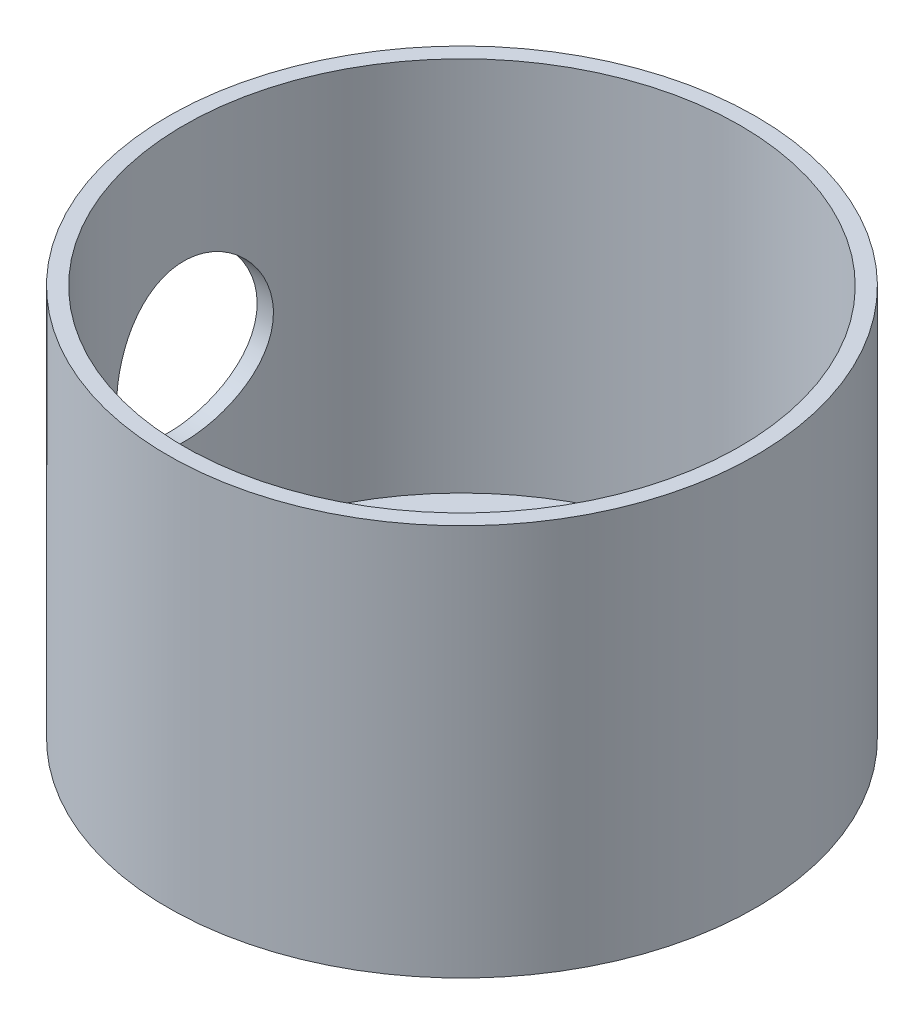
ISO-10303-21;
HEADER;
FILE_DESCRIPTION(('STEP AP214'),'2;1');
FILE_NAME('part.step','',(''),(''),'','','');
FILE_SCHEMA(('AUTOMOTIVE_DESIGN { 1 0 10303 214 1 1 1 1 }'));
ENDSEC;
DATA;
#1=APPLICATION_CONTEXT('core data for automotive mechanical design processes');
#2=APPLICATION_PROTOCOL_DEFINITION('international standard','automotive_design',2000,#1);
#3=PRODUCT_CONTEXT('',#1,'mechanical');
#4=PRODUCT('Part','Part','',(#3));
#5=PRODUCT_RELATED_PRODUCT_CATEGORY('part','',(#4));
#6=PRODUCT_DEFINITION_FORMATION('','',#4);
#7=PRODUCT_DEFINITION_CONTEXT('part definition',#1,'design');
#8=PRODUCT_DEFINITION('design','',#6,#7);
#9=PRODUCT_DEFINITION_SHAPE('','',#8);
#10=(LENGTH_UNIT() NAMED_UNIT(*) SI_UNIT(.MILLI.,.METRE.));
#11=(NAMED_UNIT(*) PLANE_ANGLE_UNIT() SI_UNIT($,.RADIAN.));
#12=(NAMED_UNIT(*) SI_UNIT($,.STERADIAN.) SOLID_ANGLE_UNIT());
#13=UNCERTAINTY_MEASURE_WITH_UNIT(LENGTH_MEASURE(1.E-05),#10,'distance_accuracy_value','');
#14=(GEOMETRIC_REPRESENTATION_CONTEXT(3) GLOBAL_UNCERTAINTY_ASSIGNED_CONTEXT((#13)) GLOBAL_UNIT_ASSIGNED_CONTEXT((#10,
#11,#12)) REPRESENTATION_CONTEXT('',''));
#15=CARTESIAN_POINT('',(0.,0.,0.));
#16=DIRECTION('',(0.,0.,1.));
#17=DIRECTION('',(1.,0.,0.));
#18=AXIS2_PLACEMENT_3D('',#15,#16,#17);
#19=CARTESIAN_POINT('',(-15.,17.7,0.));
#20=DIRECTION('',(0.,1.,0.));
#21=DIRECTION('',(0.,0.,1.));
#22=AXIS2_PLACEMENT_3D('',#19,#20,#21);
#23=PLANE('',#22);
#24=CARTESIAN_POINT('',(0.,17.7,0.));
#25=DIRECTION('',(0.,1.,0.));
#26=DIRECTION('',(0.,0.,1.));
#27=AXIS2_PLACEMENT_3D('',#24,#25,#26);
#28=CIRCLE('',#27,4.);
#29=CARTESIAN_POINT('',(0.,17.7,4.));
#30=VERTEX_POINT('',#29);
#31=EDGE_CURVE('E53',#30,#30,#28,.T.);
#32=ORIENTED_EDGE('',*,*,#31,.T.);
#33=EDGE_LOOP('',(#32));
#34=FACE_BOUND('',#33,.T.);
#35=CARTESIAN_POINT('',(0.,17.7,0.));
#36=DIRECTION('',(0.,-1.,0.));
#37=DIRECTION('',(0.,0.,-1.));
#38=AXIS2_PLACEMENT_3D('',#35,#36,#37);
#39=CIRCLE('',#38,15.);
#40=CARTESIAN_POINT('',(0.,17.7,-15.));
#41=VERTEX_POINT('',#40);
#42=EDGE_CURVE('E10',#41,#41,#39,.T.);
#43=ORIENTED_EDGE('',*,*,#42,.T.);
#44=EDGE_LOOP('',(#43));
#45=FACE_BOUND('',#44,.T.);
#46=ADVANCED_FACE('F30',(#34,#45),#23,.F.);
#47=CARTESIAN_POINT('',(0.,0.,0.));
#48=DIRECTION('',(0.,-1.,0.));
#49=DIRECTION('',(0.,0.,-1.));
#50=AXIS2_PLACEMENT_3D('',#47,#48,#49);
#51=CYLINDRICAL_SURFACE('',#50,15.);
#52=CARTESIAN_POINT('',(-14.456832294801,27.7,-4.));
#53=CARTESIAN_POINT('',(-14.456836113945,27.9203518754806,-3.99999468631742));
#54=CARTESIAN_POINT('',(-14.4619252909935,28.140760000952,-3.98172986449485));
#55=CARTESIAN_POINT('',(-14.4816712231019,28.5752108431127,-3.90929166520474));
#56=CARTESIAN_POINT('',(-14.4963327781587,28.7892503099561,-3.85510027241905));
#57=CARTESIAN_POINT('',(-14.5334475035368,29.2046161398936,-3.71271691120147));
#58=CARTESIAN_POINT('',(-14.5558897136841,29.4059599176569,-3.62457275084355));
#59=CARTESIAN_POINT('',(-14.606023098408,29.7910334801197,-3.41693569127407));
#60=CARTESIAN_POINT('',(-14.6337146806885,29.974761895014,-3.29744035682899));
#61=CARTESIAN_POINT('',(-14.6920027910693,30.3239850939754,-3.02729695749119));
#62=CARTESIAN_POINT('',(-14.7226508223289,30.4889740349289,-2.87600595008417));
#63=CARTESIAN_POINT('',(-14.7829540287301,30.7915631539024,-2.54794854568041));
#64=CARTESIAN_POINT('',(-14.8126091006688,30.9291604922836,-2.37117951069329));
#65=CARTESIAN_POINT('',(-14.8681597693684,31.1751698768059,-1.99367634174654));
#66=CARTESIAN_POINT('',(-14.8939875252459,31.2830790372657,-1.79260363975896));
#67=CARTESIAN_POINT('',(-14.9383825242367,31.4633692707345,-1.37436608945818));
#68=CARTESIAN_POINT('',(-14.9569509915253,31.5357563345631,-1.1572039617502));
#69=CARTESIAN_POINT('',(-14.9843710715292,31.6413104404715,-0.718231923620178));
#70=CARTESIAN_POINT('',(-14.9934355350053,31.6753379532518,-0.496642448401831));
#71=CARTESIAN_POINT('',(-15.001570492355,31.7059142402143,-0.0507271070171472));
#72=CARTESIAN_POINT('',(-15.0006426589323,31.7024692872603,0.173598294877067));
#73=CARTESIAN_POINT('',(-14.9890535171952,31.6588043749211,0.612628474222689));
#74=CARTESIAN_POINT('',(-14.9786382805395,31.6195140847275,0.827433201442202));
#75=CARTESIAN_POINT('',(-14.9495349718099,31.5067757244361,1.24728263114213));
#76=CARTESIAN_POINT('',(-14.9308464280136,31.4333257066278,1.45232677636124));
#77=CARTESIAN_POINT('',(-14.886931381996,31.2536403048154,1.84920789029504));
#78=CARTESIAN_POINT('',(-14.8616417575466,31.1470863857991,2.04089337265881));
#79=CARTESIAN_POINT('',(-14.8072493701969,30.9044623609813,2.4039799975293));
#80=CARTESIAN_POINT('',(-14.7781458644853,30.7683865019416,2.57537717617274));
#81=CARTESIAN_POINT('',(-14.7182254587483,30.4656462841343,2.89857073893016));
#82=CARTESIAN_POINT('',(-14.6873833872759,30.2981711099093,3.04960384035149));
#83=CARTESIAN_POINT('',(-14.6282681005693,29.9399506475144,3.32162664209938));
#84=CARTESIAN_POINT('',(-14.5999950420307,29.7492039415693,3.44261451061104));
#85=CARTESIAN_POINT('',(-14.549118045243,29.3481997963807,3.651693583714));
#86=CARTESIAN_POINT('',(-14.5265501404503,29.1378292982719,3.73957733196031));
#87=CARTESIAN_POINT('',(-14.4900865003605,28.7045470011923,3.87848003366226));
#88=CARTESIAN_POINT('',(-14.4761886145698,28.4816383271305,3.92950812921311));
#89=CARTESIAN_POINT('',(-14.459096712616,28.0367455779215,3.99193514186922));
#90=CARTESIAN_POINT('',(-14.4555952643646,27.8149329027515,4.00447265242678));
#91=CARTESIAN_POINT('',(-14.4588515677209,27.3723804543887,3.99269962245616));
#92=CARTESIAN_POINT('',(-14.4656082275034,27.1516405695216,3.96839300344559));
#93=CARTESIAN_POINT('',(-14.4883224864021,26.7218868118154,3.88462543740026));
#94=CARTESIAN_POINT('',(-14.5041007939926,26.5127291241251,3.82584895825867));
#95=CARTESIAN_POINT('',(-14.542905379049,26.1072407372805,3.67557973450926));
#96=CARTESIAN_POINT('',(-14.5659326029695,25.9109117171453,3.58408271753296));
#97=CARTESIAN_POINT('',(-14.6172714494615,25.5318900851295,3.3686581101742));
#98=CARTESIAN_POINT('',(-14.6456880974578,25.3495920482205,3.2440619047585));
#99=CARTESIAN_POINT('',(-14.7043568386728,25.0080733965937,2.96680455975028));
#100=CARTESIAN_POINT('',(-14.7346092762046,24.8488571300917,2.81413814445932));
#101=CARTESIAN_POINT('',(-14.7945992976893,24.5532950535002,2.47980756500969));
#102=CARTESIAN_POINT('',(-14.824296730477,24.4177432460428,2.2974328320177));
#103=CARTESIAN_POINT('',(-14.8789334003425,24.179178025179,1.91185687188148));
#104=CARTESIAN_POINT('',(-14.9038728906581,24.0761628798422,1.70865675403777));
#105=CARTESIAN_POINT('',(-14.9460230179852,23.906540735277,1.28862826965175));
#106=CARTESIAN_POINT('',(-14.9632911696077,23.8396619611131,1.07191570576468));
#107=CARTESIAN_POINT('',(-14.9884060757449,23.7434225438713,0.629798769462641));
#108=CARTESIAN_POINT('',(-14.9962549180996,23.7140535864506,0.404396334640487));
#109=CARTESIAN_POINT('',(-15.0015482687538,23.6941883525171,-0.0412840026923003));
#110=CARTESIAN_POINT('',(-14.9993045257616,23.7025273617377,-0.26150702305573));
#111=CARTESIAN_POINT('',(-14.9853698195772,23.7551369871504,-0.697296609261437));
#112=CARTESIAN_POINT('',(-14.9736792110957,23.7994062542341,-0.91286334962563));
#113=CARTESIAN_POINT('',(-14.9422262078185,23.9219612098372,-1.33182024692842));
#114=CARTESIAN_POINT('',(-14.9225199437846,24.0000105869449,-1.53528402370308));
#115=CARTESIAN_POINT('',(-14.8770963303299,24.1876992034925,-1.92634419694271));
#116=CARTESIAN_POINT('',(-14.8513781379851,24.2973428732256,-2.1139383633243));
#117=CARTESIAN_POINT('',(-14.7958266244824,24.548516544274,-2.47335653734734));
#118=CARTESIAN_POINT('',(-14.7659018674327,24.6908187613973,-2.64462672346662));
#119=CARTESIAN_POINT('',(-14.7056800015451,25.0018054987298,-2.96125074312266));
#120=CARTESIAN_POINT('',(-14.6753827967944,25.1704969516387,-3.10659774486097));
#121=CARTESIAN_POINT('',(-14.6170791927771,25.5339367916352,-3.37041400465123));
#122=CARTESIAN_POINT('',(-14.5891378244929,25.7291766273144,-3.48822188522467));
#123=CARTESIAN_POINT('',(-14.5396278780694,26.1374126217205,-3.68917378060109));
#124=CARTESIAN_POINT('',(-14.5180551344989,26.350397057079,-3.77234046734664));
#125=CARTESIAN_POINT('',(-14.4867200130775,26.7521626721025,-3.89076248504962));
#126=CARTESIAN_POINT('',(-14.4756028054439,26.9392025291134,-3.93163036798979));
#127=CARTESIAN_POINT('',(-14.4606577042314,27.3174811159879,-3.98624988587759));
#128=CARTESIAN_POINT('',(-14.4568289795203,27.5087193645776,-4.0000046126432));
#129=CARTESIAN_POINT('',(-14.456832294801,27.7,-4.));
#130=B_SPLINE_CURVE_WITH_KNOTS('',3,(#52,#53,#54,#55,#56,#57,#58,#59,#60,#61,#62,#63,#64,#65,
#66,#67,#68,#69,#70,#71,#72,#73,#74,#75,#76,#77,#78,#79,#80,#81,#82,#83,#84,#85,#86,#87,#88,#89,
#90,#91,#92,#93,#94,#95,#96,#97,#98,#99,#100,#101,#102,#103,#104,#105,#106,#107,#108,#109,#110,
#111,#112,#113,#114,#115,#116,#117,#118,#119,#120,#121,#122,#123,#124,#125,#126,#127,#128,#129),
.UNSPECIFIED.,.T.,.F.,(4,2,2,2,2,2,2,2,2,2,2,2,2,2,2,2,2,2,2,2,2,2,2,2,2,2,2,2,2,2,2,2,2,2,2,2,
2,2,4),(0.,0.660352256232049,1.3210358957004,1.98079262319234,2.6406006131221,3.31531832260422,
3.99010594248922,4.67570414741607,5.36118668608492,6.03096608632961,6.70063336771206,
7.35341141601607,8.00622668881391,8.6655289781114,9.32495986788982,10.0046352460066,
10.6843520527916,11.3682603019536,12.0519988484194,12.7153066848897,13.3785439269193,
14.0290370087007,14.6796150573457,15.3444926994046,16.0094954308787,16.6937181392419,
17.3779044202113,18.0568707918772,18.7356866392293,19.3936810983785,20.0516508523084,
20.7050902974225,21.3586214153685,22.0295770798807,22.7007093076701,23.3866007797608,
24.0720426420754,24.6453393534799,25.2185706858622),.UNSPECIFIED.);
#131=CARTESIAN_POINT('',(-14.456832294801,27.7,-4.));
#132=VERTEX_POINT('',#131);
#133=EDGE_CURVE('E59',#132,#132,#130,.T.);
#134=ORIENTED_EDGE('',*,*,#133,.T.);
#135=EDGE_LOOP('',(#134));
#136=FACE_BOUND('',#135,.T.);
#137=ORIENTED_EDGE('',*,*,#42,.F.);
#138=EDGE_LOOP('',(#137));
#139=FACE_BOUND('',#138,.T.);
#140=CARTESIAN_POINT('',(0.,37.7,0.));
#141=DIRECTION('',(0.,-1.,0.));
#142=DIRECTION('',(0.,0.,-1.));
#143=AXIS2_PLACEMENT_3D('',#140,#141,#142);
#144=CIRCLE('',#143,15.);
#145=CARTESIAN_POINT('',(0.,37.7,-15.));
#146=VERTEX_POINT('',#145);
#147=EDGE_CURVE('E41',#146,#146,#144,.T.);
#148=ORIENTED_EDGE('',*,*,#147,.T.);
#149=EDGE_LOOP('',(#148));
#150=FACE_BOUND('',#149,.T.);
#151=ADVANCED_FACE('F63',(#136,#139,#150),#51,.T.);
#152=CARTESIAN_POINT('',(-15.,37.7,0.));
#153=DIRECTION('',(0.,-1.,0.));
#154=DIRECTION('',(0.,0.,-1.));
#155=AXIS2_PLACEMENT_3D('',#152,#153,#154);
#156=PLANE('',#155);
#157=ORIENTED_EDGE('',*,*,#147,.F.);
#158=EDGE_LOOP('',(#157));
#159=FACE_BOUND('',#158,.T.);
#160=CARTESIAN_POINT('',(0.,37.7,0.));
#161=DIRECTION('',(0.,-1.,0.));
#162=DIRECTION('',(0.,0.,-1.));
#163=AXIS2_PLACEMENT_3D('',#160,#161,#162);
#164=CIRCLE('',#163,14.2);
#165=CARTESIAN_POINT('',(0.,37.7,-14.2));
#166=VERTEX_POINT('',#165);
#167=EDGE_CURVE('E45',#166,#166,#164,.T.);
#168=ORIENTED_EDGE('',*,*,#167,.T.);
#169=EDGE_LOOP('',(#168));
#170=FACE_BOUND('',#169,.T.);
#171=ADVANCED_FACE('F82',(#159,#170),#156,.F.);
#172=CARTESIAN_POINT('',(0.,0.,0.));
#173=DIRECTION('',(0.,-1.,0.));
#174=DIRECTION('',(0.,0.,-1.));
#175=AXIS2_PLACEMENT_3D('',#172,#173,#174);
#176=CYLINDRICAL_SURFACE('',#175,14.2);
#177=CARTESIAN_POINT('',(-13.6249770642009,27.7,-4.));
#178=CARTESIAN_POINT('',(-13.6249803259452,27.4801559317329,-3.99999572933769));
#179=CARTESIAN_POINT('',(-13.6303561674231,27.2602683119926,-3.98181400001963));
#180=CARTESIAN_POINT('',(-13.651205106593,26.8268776903344,-3.90972668695141));
#181=CARTESIAN_POINT('',(-13.6666825160762,26.6133774555498,-3.85580584803258));
#182=CARTESIAN_POINT('',(-13.7058456348098,26.1990952857319,-3.71418112512093));
#183=CARTESIAN_POINT('',(-13.7295188832796,25.9982945875933,-3.62652850377384));
#184=CARTESIAN_POINT('',(-13.7823900027917,25.6142088035366,-3.42009263281426));
#185=CARTESIAN_POINT('',(-13.8115884815341,25.4309256476502,-3.30130595832586));
#186=CARTESIAN_POINT('',(-13.8731334407927,25.0819639114694,-3.03242765551117));
#187=CARTESIAN_POINT('',(-13.9055407781593,24.9168464710694,-2.88162152784335));
#188=CARTESIAN_POINT('',(-13.9693291096081,24.6138800418891,-2.55451945045529));
#189=CARTESIAN_POINT('',(-14.0007099862523,24.4760341642184,-2.37822059651928));
#190=CARTESIAN_POINT('',(-14.0595940738432,24.2291417149997,-2.00120237609832));
#191=CARTESIAN_POINT('',(-14.087017161241,24.1206592593468,-1.80009999062994));
#192=CARTESIAN_POINT('',(-14.1341937369454,23.9392627757483,-1.38160638788408));
#193=CARTESIAN_POINT('',(-14.1539486747126,23.8663420251358,-1.16421825827217));
#194=CARTESIAN_POINT('',(-14.1831326734492,23.759972851196,-0.725187314376212));
#195=CARTESIAN_POINT('',(-14.1928113837343,23.7255684268611,-0.503793011476485));
#196=CARTESIAN_POINT('',(-14.201628023242,23.6941941562554,-0.0581774304061145));
#197=CARTESIAN_POINT('',(-14.2007679130151,23.6972173472781,0.166043314204954));
#198=CARTESIAN_POINT('',(-14.188783931876,23.7399530170042,0.60426992705376));
#199=CARTESIAN_POINT('',(-14.1779492983589,23.7786316156944,0.818385752412765));
#200=CARTESIAN_POINT('',(-14.1475793938468,23.8899017908547,1.23695468548469));
#201=CARTESIAN_POINT('',(-14.1280436000739,23.9624954049997,1.44140721179647));
#202=CARTESIAN_POINT('',(-14.0820502231798,24.1402863769039,1.83740535411256));
#203=CARTESIAN_POINT('',(-14.055520636171,24.2458251304138,2.02878898682966));
#204=CARTESIAN_POINT('',(-13.9983790235881,24.4862451982922,2.39147275972531));
#205=CARTESIAN_POINT('',(-13.9677661248636,24.6211327923427,2.56276858968766));
#206=CARTESIAN_POINT('',(-13.9045240478077,24.9218559510579,2.88658674836734));
#207=CARTESIAN_POINT('',(-13.8718617146484,25.088590983447,3.03826832828847));
#208=CARTESIAN_POINT('',(-13.8091324090739,25.4454624835265,3.31173673769813));
#209=CARTESIAN_POINT('',(-13.7790656353181,25.6356007397609,3.43352128023379));
#210=CARTESIAN_POINT('',(-13.7247868964874,26.035873381271,3.64447966744271));
#211=CARTESIAN_POINT('',(-13.7006209756511,26.2461482423757,3.73339966829775));
#212=CARTESIAN_POINT('',(-13.6614389831681,26.6795184649312,3.87433815413653));
#213=CARTESIAN_POINT('',(-13.6464203359367,26.902610198175,3.92636702718076));
#214=CARTESIAN_POINT('',(-13.6277894477523,27.3473569736008,3.99054407425941));
#215=CARTESIAN_POINT('',(-13.6238156538613,27.5688145650649,4.00395688995304));
#216=CARTESIAN_POINT('',(-13.6267305106821,28.010813577336,3.99402621413993));
#217=CARTESIAN_POINT('',(-13.633617850414,28.2313551054939,3.97068715872353));
#218=CARTESIAN_POINT('',(-13.657127186143,28.6602160321524,3.88903537544138));
#219=CARTESIAN_POINT('',(-13.6735308830927,28.8686977754776,3.83150624494543));
#220=CARTESIAN_POINT('',(-13.7140057146381,29.2730463498457,3.68400033519312));
#221=CARTESIAN_POINT('',(-13.7380779334932,29.4689113922906,3.5940189672473));
#222=CARTESIAN_POINT('',(-13.7919015361261,29.8476932557397,3.38166989211293));
#223=CARTESIAN_POINT('',(-13.8217760548052,30.0301830325157,3.25857239412487));
#224=CARTESIAN_POINT('',(-13.8835597343057,30.3723794314004,2.9843731288286));
#225=CARTESIAN_POINT('',(-13.9154693225169,30.5320812448058,2.83326546625204));
#226=CARTESIAN_POINT('',(-13.9789908549667,30.8295404372501,2.50144327360559));
#227=CARTESIAN_POINT('',(-14.0105589379841,30.9664093616951,2.31992211352595));
#228=CARTESIAN_POINT('',(-14.0687785470627,31.2077469389976,1.93575719948422));
#229=CARTESIAN_POINT('',(-14.0954303321573,31.3122172990916,1.73311455926674));
#230=CARTESIAN_POINT('',(-14.1406437373416,31.4848009371451,1.31387157574015));
#231=CARTESIAN_POINT('',(-14.1592663708218,31.5531893248675,1.09739138742652));
#232=CARTESIAN_POINT('',(-14.1865925548221,31.6524316118849,0.655401186238838));
#233=CARTESIAN_POINT('',(-14.195298579615,31.6832948741267,0.429893440354377));
#234=CARTESIAN_POINT('',(-14.2016788746809,31.7059685227053,-0.0154911312798037));
#235=CARTESIAN_POINT('',(-14.1997193688085,31.699075306213,-0.235297595069703));
#236=CARTESIAN_POINT('',(-14.1858322749311,31.6494806707175,-0.670493706502082));
#237=CARTESIAN_POINT('',(-14.1739051411901,31.6067808835601,-0.88588355496875));
#238=CARTESIAN_POINT('',(-14.1415100275298,31.4875505966883,-1.30438268922566));
#239=CARTESIAN_POINT('',(-14.1211152789307,31.4113098435326,-1.50758057336578));
#240=CARTESIAN_POINT('',(-14.0739056002594,31.2274194898035,-1.89841379604447));
#241=CARTESIAN_POINT('',(-14.047089695033,31.1197651180323,-2.08604676497163));
#242=CARTESIAN_POINT('',(-13.9889126152182,30.8724602691663,-2.4463481565054));
#243=CARTESIAN_POINT('',(-13.9574419058204,30.7319700798691,-2.61842243425182));
#244=CARTESIAN_POINT('',(-13.8939026315898,30.424538629299,-2.93699001572475));
#245=CARTESIAN_POINT('',(-13.8618339055267,30.2575901409556,-3.08347630705714));
#246=CARTESIAN_POINT('',(-13.7997849401264,29.8968997726152,-3.350407184819));
#247=CARTESIAN_POINT('',(-13.7698781493006,29.70258647209,-3.47009840424258));
#248=CARTESIAN_POINT('',(-13.7166316345286,29.2957770795723,-3.67495441673744));
#249=CARTESIAN_POINT('',(-13.6932880999998,29.0832916320624,-3.76013925669653));
#250=CARTESIAN_POINT('',(-13.658651795515,28.67669197747,-3.8839094565218));
#251=CARTESIAN_POINT('',(-13.6461331802941,28.4841428821047,-3.9273337456603));
#252=CARTESIAN_POINT('',(-13.629294955967,28.0944070822426,-3.98537880978047));
#253=CARTESIAN_POINT('',(-13.6249741381056,27.8972210657955,-4.0000038311908));
#254=CARTESIAN_POINT('',(-13.6249770642009,27.7,-4.));
#255=B_SPLINE_CURVE_WITH_KNOTS('',3,(#177,#178,#179,#180,#181,#182,#183,#184,#185,#186,#187,
#188,#189,#190,#191,#192,#193,#194,#195,#196,#197,#198,#199,#200,#201,#202,#203,#204,#205,#206,
#207,#208,#209,#210,#211,#212,#213,#214,#215,#216,#217,#218,#219,#220,#221,#222,#223,#224,#225,
#226,#227,#228,#229,#230,#231,#232,#233,#234,#235,#236,#237,#238,#239,#240,#241,#242,#243,#244,
#245,#246,#247,#248,#249,#250,#251,#252,#253,#254),.UNSPECIFIED.,.T.,.F.,(4,2,2,2,2,2,2,2,2,2,2,
2,2,2,2,2,2,2,2,2,2,2,2,2,2,2,2,2,2,2,2,2,2,2,2,2,2,2,4),(0.,0.658806016600982,1.3178934245105,
1.97598313876067,2.63414527603446,3.30892036862912,3.98377239448933,4.67079306837686,
5.35768381589525,6.02711890700555,6.69642946413273,7.34692288156043,7.99745538682293,
8.65496633516823,9.31261810772238,9.9927257677828,10.6728854360016,11.3581939520817,
12.0433094175022,12.7057175894117,13.3680458122694,14.015749822881,14.6635454536336,
15.3269885801357,15.99057149965,16.6758557121263,17.3611038075392,18.0410487826248,
18.7208240688454,19.3774083060266,20.0339626217186,20.6849533173197,21.3360429389157,
22.0060739127222,22.6762882215827,23.3634739256089,24.0502598264435,24.6413587274383,
25.2323704648518),.UNSPECIFIED.);
#256=CARTESIAN_POINT('',(-13.6249770642009,27.7,-4.));
#257=VERTEX_POINT('',#256);
#258=EDGE_CURVE('E33',#257,#257,#255,.T.);
#259=ORIENTED_EDGE('',*,*,#258,.T.);
#260=EDGE_LOOP('',(#259));
#261=FACE_BOUND('',#260,.T.);
#262=ORIENTED_EDGE('',*,*,#167,.F.);
#263=EDGE_LOOP('',(#262));
#264=FACE_BOUND('',#263,.T.);
#265=CARTESIAN_POINT('',(0.,18.5,0.));
#266=DIRECTION('',(0.,-1.,0.));
#267=DIRECTION('',(0.,0.,-1.));
#268=AXIS2_PLACEMENT_3D('',#265,#266,#267);
#269=CIRCLE('',#268,14.2);
#270=CARTESIAN_POINT('',(0.,18.5,-14.2));
#271=VERTEX_POINT('',#270);
#272=EDGE_CURVE('E50',#271,#271,#269,.T.);
#273=ORIENTED_EDGE('',*,*,#272,.T.);
#274=EDGE_LOOP('',(#273));
#275=FACE_BOUND('',#274,.T.);
#276=ADVANCED_FACE('F78',(#261,#264,#275),#176,.F.);
#277=CARTESIAN_POINT('',(-14.2,18.5,0.));
#278=DIRECTION('',(0.,-1.,0.));
#279=DIRECTION('',(0.,0.,-1.));
#280=AXIS2_PLACEMENT_3D('',#277,#278,#279);
#281=PLANE('',#280);
#282=CARTESIAN_POINT('',(0.,18.5,0.));
#283=DIRECTION('',(0.,1.,0.));
#284=DIRECTION('',(0.,0.,1.));
#285=AXIS2_PLACEMENT_3D('',#282,#283,#284);
#286=CIRCLE('',#285,4.);
#287=CARTESIAN_POINT('',(0.,18.5,4.));
#288=VERTEX_POINT('',#287);
#289=EDGE_CURVE('E56',#288,#288,#286,.T.);
#290=ORIENTED_EDGE('',*,*,#289,.F.);
#291=EDGE_LOOP('',(#290));
#292=FACE_BOUND('',#291,.T.);
#293=ORIENTED_EDGE('',*,*,#272,.F.);
#294=EDGE_LOOP('',(#293));
#295=FACE_BOUND('',#294,.T.);
#296=ADVANCED_FACE('F75',(#292,#295),#281,.F.);
#297=CARTESIAN_POINT('',(0.,8.5,0.));
#298=DIRECTION('',(0.,1.,0.));
#299=DIRECTION('',(0.,0.,1.));
#300=AXIS2_PLACEMENT_3D('',#297,#298,#299);
#301=CYLINDRICAL_SURFACE('',#300,4.);
#302=ORIENTED_EDGE('',*,*,#289,.T.);
#303=EDGE_LOOP('',(#302));
#304=FACE_BOUND('',#303,.T.);
#305=ORIENTED_EDGE('',*,*,#31,.F.);
#306=EDGE_LOOP('',(#305));
#307=FACE_BOUND('',#306,.T.);
#308=ADVANCED_FACE('F70',(#304,#307),#301,.F.);
#309=CARTESIAN_POINT('',(-18.,27.7,0.));
#310=DIRECTION('',(1.,0.,0.));
#311=DIRECTION('',(0.,0.,-1.));
#312=AXIS2_PLACEMENT_3D('',#309,#310,#311);
#313=CYLINDRICAL_SURFACE('',#312,4.);
#314=ORIENTED_EDGE('',*,*,#258,.F.);
#315=EDGE_LOOP('',(#314));
#316=FACE_BOUND('',#315,.T.);
#317=ORIENTED_EDGE('',*,*,#133,.F.);
#318=EDGE_LOOP('',(#317));
#319=FACE_BOUND('',#318,.T.);
#320=ADVANCED_FACE('F66',(#316,#319),#313,.F.);
#321=CLOSED_SHELL('',(#46,#151,#171,#276,#296,#308,#320));
#322=MANIFOLD_SOLID_BREP('B2',#321);
#323=ADVANCED_BREP_SHAPE_REPRESENTATION('',(#18,#322),#14);
#324=SHAPE_DEFINITION_REPRESENTATION(#9,#323);
ENDSEC;
END-ISO-10303-21;
